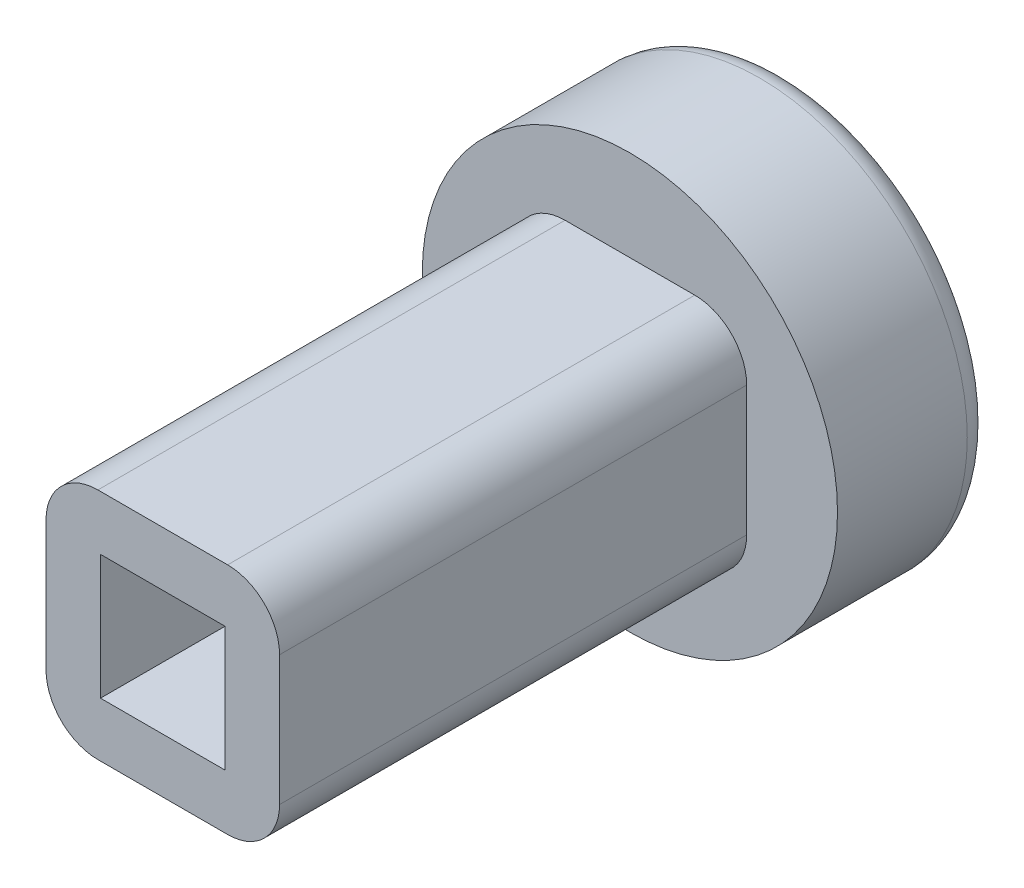
ISO-10303-21;
HEADER;
FILE_DESCRIPTION(('STEP AP214'),'2;1');
FILE_NAME('part.step','',(''),(''),'','','');
FILE_SCHEMA(('AUTOMOTIVE_DESIGN { 1 0 10303 214 1 1 1 1 }'));
ENDSEC;
DATA;
#1=APPLICATION_CONTEXT('core data for automotive mechanical design processes');
#2=APPLICATION_PROTOCOL_DEFINITION('international standard','automotive_design',2000,#1);
#3=PRODUCT_CONTEXT('',#1,'mechanical');
#4=PRODUCT('Part','Part','',(#3));
#5=PRODUCT_RELATED_PRODUCT_CATEGORY('part','',(#4));
#6=PRODUCT_DEFINITION_FORMATION('','',#4);
#7=PRODUCT_DEFINITION_CONTEXT('part definition',#1,'design');
#8=PRODUCT_DEFINITION('design','',#6,#7);
#9=PRODUCT_DEFINITION_SHAPE('','',#8);
#10=(LENGTH_UNIT() NAMED_UNIT(*) SI_UNIT(.MILLI.,.METRE.));
#11=(NAMED_UNIT(*) PLANE_ANGLE_UNIT() SI_UNIT($,.RADIAN.));
#12=(NAMED_UNIT(*) SI_UNIT($,.STERADIAN.) SOLID_ANGLE_UNIT());
#13=UNCERTAINTY_MEASURE_WITH_UNIT(LENGTH_MEASURE(1.E-05),#10,'distance_accuracy_value','');
#14=(GEOMETRIC_REPRESENTATION_CONTEXT(3) GLOBAL_UNCERTAINTY_ASSIGNED_CONTEXT((#13)) GLOBAL_UNIT_ASSIGNED_CONTEXT((#10,
#11,#12)) REPRESENTATION_CONTEXT('',''));
#15=CARTESIAN_POINT('',(0.,0.,0.));
#16=DIRECTION('',(0.,0.,1.));
#17=DIRECTION('',(1.,0.,0.));
#18=AXIS2_PLACEMENT_3D('',#15,#16,#17);
#19=CARTESIAN_POINT('',(0.,0.,3.));
#20=DIRECTION('',(0.,0.,-1.));
#21=DIRECTION('',(-1.,0.,0.));
#22=AXIS2_PLACEMENT_3D('',#19,#20,#21);
#23=CYLINDRICAL_SURFACE('',#22,4.);
#24=CARTESIAN_POINT('',(0.,0.,0.5));
#25=DIRECTION('',(0.,0.,1.));
#26=DIRECTION('',(1.,0.,0.));
#27=AXIS2_PLACEMENT_3D('',#24,#25,#26);
#28=CIRCLE('',#27,4.);
#29=CARTESIAN_POINT('',(4.,0.,0.5));
#30=VERTEX_POINT('',#29);
#31=EDGE_CURVE('E41',#30,#30,#28,.T.);
#32=ORIENTED_EDGE('',*,*,#31,.T.);
#33=EDGE_LOOP('',(#32));
#34=FACE_BOUND('',#33,.T.);
#35=CARTESIAN_POINT('',(0.,0.,3.));
#36=DIRECTION('',(0.,0.,1.));
#37=DIRECTION('',(1.,0.,0.));
#38=AXIS2_PLACEMENT_3D('',#35,#36,#37);
#39=CIRCLE('',#38,4.);
#40=CARTESIAN_POINT('',(4.,0.,3.));
#41=VERTEX_POINT('',#40);
#42=EDGE_CURVE('E180',#41,#41,#39,.T.);
#43=ORIENTED_EDGE('',*,*,#42,.F.);
#44=EDGE_LOOP('',(#43));
#45=FACE_BOUND('',#44,.T.);
#46=ADVANCED_FACE('F33',(#34,#45),#23,.T.);
#47=CARTESIAN_POINT('',(0.,0.,3.));
#48=DIRECTION('',(0.,0.,1.));
#49=DIRECTION('',(1.,0.,0.));
#50=AXIS2_PLACEMENT_3D('',#47,#48,#49);
#51=PLANE('',#50);
#52=DIRECTION('',(0.,-1.,0.));
#53=VECTOR('',#52,1.);
#54=CARTESIAN_POINT('',(-2.25,2.25,3.));
#55=LINE('',#54,#53);
#56=CARTESIAN_POINT('',(-2.25,1.25,3.));
#57=VERTEX_POINT('',#56);
#58=CARTESIAN_POINT('',(-2.25,-1.25,3.));
#59=VERTEX_POINT('',#58);
#60=EDGE_CURVE('E163',#57,#59,#55,.T.);
#61=ORIENTED_EDGE('',*,*,#60,.F.);
#62=CARTESIAN_POINT('',(-1.25,1.25,3.));
#63=DIRECTION('',(0.,0.,1.));
#64=DIRECTION('',(1.,0.,0.));
#65=AXIS2_PLACEMENT_3D('',#62,#63,#64);
#66=CIRCLE('',#65,1.);
#67=CARTESIAN_POINT('',(-1.25,2.25,3.));
#68=VERTEX_POINT('',#67);
#69=EDGE_CURVE('E219',#57,#68,#66,.F.);
#70=ORIENTED_EDGE('',*,*,#69,.T.);
#71=DIRECTION('',(-1.,0.,0.));
#72=VECTOR('',#71,1.);
#73=CARTESIAN_POINT('',(2.25,2.25,3.));
#74=LINE('',#73,#72);
#75=CARTESIAN_POINT('',(1.25,2.25,3.));
#76=VERTEX_POINT('',#75);
#77=EDGE_CURVE('E171',#76,#68,#74,.T.);
#78=ORIENTED_EDGE('',*,*,#77,.F.);
#79=CARTESIAN_POINT('',(1.25,1.25,3.));
#80=DIRECTION('',(0.,0.,1.));
#81=DIRECTION('',(1.,0.,0.));
#82=AXIS2_PLACEMENT_3D('',#79,#80,#81);
#83=CIRCLE('',#82,1.);
#84=CARTESIAN_POINT('',(2.25,1.25,3.));
#85=VERTEX_POINT('',#84);
#86=EDGE_CURVE('E221',#76,#85,#83,.F.);
#87=ORIENTED_EDGE('',*,*,#86,.T.);
#88=DIRECTION('',(0.,1.,0.));
#89=VECTOR('',#88,1.);
#90=CARTESIAN_POINT('',(2.25,2.25,3.));
#91=LINE('',#90,#89);
#92=CARTESIAN_POINT('',(2.25,-1.25,3.));
#93=VERTEX_POINT('',#92);
#94=EDGE_CURVE('E185',#93,#85,#91,.T.);
#95=ORIENTED_EDGE('',*,*,#94,.F.);
#96=CARTESIAN_POINT('',(1.25,-1.25,3.));
#97=DIRECTION('',(0.,0.,1.));
#98=DIRECTION('',(1.,0.,0.));
#99=AXIS2_PLACEMENT_3D('',#96,#97,#98);
#100=CIRCLE('',#99,1.);
#101=CARTESIAN_POINT('',(1.25,-2.25,3.));
#102=VERTEX_POINT('',#101);
#103=EDGE_CURVE('E48',#93,#102,#100,.F.);
#104=ORIENTED_EDGE('',*,*,#103,.T.);
#105=DIRECTION('',(1.,0.,0.));
#106=VECTOR('',#105,1.);
#107=CARTESIAN_POINT('',(2.25,-2.25,3.));
#108=LINE('',#107,#106);
#109=CARTESIAN_POINT('',(-1.25,-2.25,3.));
#110=VERTEX_POINT('',#109);
#111=EDGE_CURVE('E183',#110,#102,#108,.T.);
#112=ORIENTED_EDGE('',*,*,#111,.F.);
#113=CARTESIAN_POINT('',(-1.25,-1.25,3.));
#114=DIRECTION('',(0.,0.,1.));
#115=DIRECTION('',(1.,0.,0.));
#116=AXIS2_PLACEMENT_3D('',#113,#114,#115);
#117=CIRCLE('',#116,1.);
#118=EDGE_CURVE('E56',#110,#59,#117,.F.);
#119=ORIENTED_EDGE('',*,*,#118,.T.);
#120=EDGE_LOOP('',(#61,#70,#78,#87,#95,#104,#112,#119));
#121=FACE_BOUND('',#120,.T.);
#122=ORIENTED_EDGE('',*,*,#42,.T.);
#123=EDGE_LOOP('',(#122));
#124=FACE_BOUND('',#123,.T.);
#125=ADVANCED_FACE('F238',(#121,#124),#51,.T.);
#126=CARTESIAN_POINT('',(0.,0.,0.));
#127=DIRECTION('',(0.,0.,1.));
#128=DIRECTION('',(1.,0.,0.));
#129=AXIS2_PLACEMENT_3D('',#126,#127,#128);
#130=PLANE('',#129);
#131=CARTESIAN_POINT('',(0.,0.,0.));
#132=DIRECTION('',(0.,0.,1.));
#133=DIRECTION('',(1.,0.,0.));
#134=AXIS2_PLACEMENT_3D('',#131,#132,#133);
#135=CIRCLE('',#134,3.5);
#136=CARTESIAN_POINT('',(3.5,0.,0.));
#137=VERTEX_POINT('',#136);
#138=EDGE_CURVE('E11',#137,#137,#135,.F.);
#139=ORIENTED_EDGE('',*,*,#138,.T.);
#140=EDGE_LOOP('',(#139));
#141=FACE_BOUND('',#140,.T.);
#142=ADVANCED_FACE('F243',(#141),#130,.F.);
#143=CARTESIAN_POINT('',(-2.25,2.25,12.));
#144=DIRECTION('',(1.,0.,0.));
#145=DIRECTION('',(0.,1.,0.));
#146=AXIS2_PLACEMENT_3D('',#143,#144,#145);
#147=PLANE('',#146);
#148=DIRECTION('',(0.,-1.,0.));
#149=VECTOR('',#148,1.);
#150=CARTESIAN_POINT('',(-2.25,2.25,12.));
#151=LINE('',#150,#149);
#152=CARTESIAN_POINT('',(-2.25,1.25,12.));
#153=VERTEX_POINT('',#152);
#154=CARTESIAN_POINT('',(-2.25,-1.25,12.));
#155=VERTEX_POINT('',#154);
#156=EDGE_CURVE('E167',#153,#155,#151,.T.);
#157=ORIENTED_EDGE('',*,*,#156,.F.);
#158=DIRECTION('',(0.,0.,-1.));
#159=VECTOR('',#158,1.);
#160=CARTESIAN_POINT('',(-2.25,1.25,12.));
#161=LINE('',#160,#159);
#162=EDGE_CURVE('E194',#153,#57,#161,.T.);
#163=ORIENTED_EDGE('',*,*,#162,.T.);
#164=ORIENTED_EDGE('',*,*,#60,.T.);
#165=DIRECTION('',(0.,0.,-1.));
#166=VECTOR('',#165,1.);
#167=CARTESIAN_POINT('',(-2.25,-1.25,12.));
#168=LINE('',#167,#166);
#169=EDGE_CURVE('E192',#59,#155,#168,.F.);
#170=ORIENTED_EDGE('',*,*,#169,.T.);
#171=EDGE_LOOP('',(#157,#163,#164,#170));
#172=FACE_BOUND('',#171,.T.);
#173=ADVANCED_FACE('F281',(#172),#147,.F.);
#174=CARTESIAN_POINT('',(2.25,-2.25,12.));
#175=DIRECTION('',(0.,1.,0.));
#176=DIRECTION('',(-1.,0.,0.));
#177=AXIS2_PLACEMENT_3D('',#174,#175,#176);
#178=PLANE('',#177);
#179=ORIENTED_EDGE('',*,*,#111,.T.);
#180=DIRECTION('',(0.,0.,-1.));
#181=VECTOR('',#180,1.);
#182=CARTESIAN_POINT('',(1.25,-2.25,12.));
#183=LINE('',#182,#181);
#184=CARTESIAN_POINT('',(1.25,-2.25,12.));
#185=VERTEX_POINT('',#184);
#186=EDGE_CURVE('E217',#102,#185,#183,.F.);
#187=ORIENTED_EDGE('',*,*,#186,.T.);
#188=DIRECTION('',(1.,0.,0.));
#189=VECTOR('',#188,1.);
#190=CARTESIAN_POINT('',(2.25,-2.25,12.));
#191=LINE('',#190,#189);
#192=CARTESIAN_POINT('',(-1.25,-2.25,12.));
#193=VERTEX_POINT('',#192);
#194=EDGE_CURVE('E170',#193,#185,#191,.T.);
#195=ORIENTED_EDGE('',*,*,#194,.F.);
#196=DIRECTION('',(0.,0.,-1.));
#197=VECTOR('',#196,1.);
#198=CARTESIAN_POINT('',(-1.25,-2.25,12.));
#199=LINE('',#198,#197);
#200=EDGE_CURVE('E215',#193,#110,#199,.T.);
#201=ORIENTED_EDGE('',*,*,#200,.T.);
#202=EDGE_LOOP('',(#179,#187,#195,#201));
#203=FACE_BOUND('',#202,.T.);
#204=ADVANCED_FACE('F284',(#203),#178,.F.);
#205=CARTESIAN_POINT('',(2.25,2.25,12.));
#206=DIRECTION('',(-1.,0.,0.));
#207=DIRECTION('',(0.,-1.,0.));
#208=AXIS2_PLACEMENT_3D('',#205,#206,#207);
#209=PLANE('',#208);
#210=ORIENTED_EDGE('',*,*,#94,.T.);
#211=DIRECTION('',(0.,0.,-1.));
#212=VECTOR('',#211,1.);
#213=CARTESIAN_POINT('',(2.25,1.25,12.));
#214=LINE('',#213,#212);
#215=CARTESIAN_POINT('',(2.25,1.25,12.));
#216=VERTEX_POINT('',#215);
#217=EDGE_CURVE('E213',#85,#216,#214,.F.);
#218=ORIENTED_EDGE('',*,*,#217,.T.);
#219=DIRECTION('',(0.,1.,0.));
#220=VECTOR('',#219,1.);
#221=CARTESIAN_POINT('',(2.25,2.25,12.));
#222=LINE('',#221,#220);
#223=CARTESIAN_POINT('',(2.25,-1.25,12.));
#224=VERTEX_POINT('',#223);
#225=EDGE_CURVE('E174',#224,#216,#222,.T.);
#226=ORIENTED_EDGE('',*,*,#225,.F.);
#227=DIRECTION('',(0.,0.,-1.));
#228=VECTOR('',#227,1.);
#229=CARTESIAN_POINT('',(2.25,-1.25,12.));
#230=LINE('',#229,#228);
#231=EDGE_CURVE('E210',#224,#93,#230,.T.);
#232=ORIENTED_EDGE('',*,*,#231,.T.);
#233=EDGE_LOOP('',(#210,#218,#226,#232));
#234=FACE_BOUND('',#233,.T.);
#235=ADVANCED_FACE('F268',(#234),#209,.F.);
#236=CARTESIAN_POINT('',(2.25,2.25,12.));
#237=DIRECTION('',(0.,-1.,0.));
#238=DIRECTION('',(1.,0.,0.));
#239=AXIS2_PLACEMENT_3D('',#236,#237,#238);
#240=PLANE('',#239);
#241=ORIENTED_EDGE('',*,*,#77,.T.);
#242=DIRECTION('',(0.,0.,-1.));
#243=VECTOR('',#242,1.);
#244=CARTESIAN_POINT('',(-1.25,2.25,12.));
#245=LINE('',#244,#243);
#246=CARTESIAN_POINT('',(-1.25,2.25,12.));
#247=VERTEX_POINT('',#246);
#248=EDGE_CURVE('E200',#68,#247,#245,.F.);
#249=ORIENTED_EDGE('',*,*,#248,.T.);
#250=DIRECTION('',(-1.,0.,0.));
#251=VECTOR('',#250,1.);
#252=CARTESIAN_POINT('',(2.25,2.25,12.));
#253=LINE('',#252,#251);
#254=CARTESIAN_POINT('',(1.25,2.25,12.));
#255=VERTEX_POINT('',#254);
#256=EDGE_CURVE('E177',#255,#247,#253,.T.);
#257=ORIENTED_EDGE('',*,*,#256,.F.);
#258=DIRECTION('',(0.,0.,-1.));
#259=VECTOR('',#258,1.);
#260=CARTESIAN_POINT('',(1.25,2.25,12.));
#261=LINE('',#260,#259);
#262=EDGE_CURVE('E197',#255,#76,#261,.T.);
#263=ORIENTED_EDGE('',*,*,#262,.T.);
#264=EDGE_LOOP('',(#241,#249,#257,#263));
#265=FACE_BOUND('',#264,.T.);
#266=ADVANCED_FACE('F274',(#265),#240,.F.);
#267=CARTESIAN_POINT('',(0.,0.,12.));
#268=DIRECTION('',(0.,0.,-1.));
#269=DIRECTION('',(-1.,0.,0.));
#270=AXIS2_PLACEMENT_3D('',#267,#268,#269);
#271=PLANE('',#270);
#272=DIRECTION('',(1.,0.,0.));
#273=VECTOR('',#272,1.);
#274=CARTESIAN_POINT('',(1.2,-1.2,12.));
#275=LINE('',#274,#273);
#276=CARTESIAN_POINT('',(-1.2,-1.2,12.));
#277=VERTEX_POINT('',#276);
#278=CARTESIAN_POINT('',(1.2,-1.2,12.));
#279=VERTEX_POINT('',#278);
#280=EDGE_CURVE('E157',#277,#279,#275,.T.);
#281=ORIENTED_EDGE('',*,*,#280,.F.);
#282=DIRECTION('',(0.,-1.,0.));
#283=VECTOR('',#282,1.);
#284=CARTESIAN_POINT('',(-1.2,1.2,12.));
#285=LINE('',#284,#283);
#286=CARTESIAN_POINT('',(-1.2,1.2,12.));
#287=VERTEX_POINT('',#286);
#288=EDGE_CURVE('E131',#287,#277,#285,.T.);
#289=ORIENTED_EDGE('',*,*,#288,.F.);
#290=DIRECTION('',(-1.,0.,0.));
#291=VECTOR('',#290,1.);
#292=CARTESIAN_POINT('',(1.2,1.2,12.));
#293=LINE('',#292,#291);
#294=CARTESIAN_POINT('',(1.2,1.2,12.));
#295=VERTEX_POINT('',#294);
#296=EDGE_CURVE('E148',#295,#287,#293,.T.);
#297=ORIENTED_EDGE('',*,*,#296,.F.);
#298=DIRECTION('',(0.,1.,0.));
#299=VECTOR('',#298,1.);
#300=CARTESIAN_POINT('',(1.2,1.2,12.));
#301=LINE('',#300,#299);
#302=EDGE_CURVE('E151',#279,#295,#301,.T.);
#303=ORIENTED_EDGE('',*,*,#302,.F.);
#304=EDGE_LOOP('',(#281,#289,#297,#303));
#305=FACE_BOUND('',#304,.T.);
#306=ORIENTED_EDGE('',*,*,#256,.T.);
#307=CARTESIAN_POINT('',(-1.25,1.25,12.));
#308=DIRECTION('',(0.,0.,-1.));
#309=DIRECTION('',(-1.,0.,0.));
#310=AXIS2_PLACEMENT_3D('',#307,#308,#309);
#311=CIRCLE('',#310,1.);
#312=EDGE_CURVE('E208',#247,#153,#311,.F.);
#313=ORIENTED_EDGE('',*,*,#312,.T.);
#314=ORIENTED_EDGE('',*,*,#156,.T.);
#315=CARTESIAN_POINT('',(-1.25,-1.25,12.));
#316=DIRECTION('',(0.,0.,-1.));
#317=DIRECTION('',(-1.,0.,0.));
#318=AXIS2_PLACEMENT_3D('',#315,#316,#317);
#319=CIRCLE('',#318,1.);
#320=EDGE_CURVE('E202',#155,#193,#319,.F.);
#321=ORIENTED_EDGE('',*,*,#320,.T.);
#322=ORIENTED_EDGE('',*,*,#194,.T.);
#323=CARTESIAN_POINT('',(1.25,-1.25,12.));
#324=DIRECTION('',(0.,0.,-1.));
#325=DIRECTION('',(-1.,0.,0.));
#326=AXIS2_PLACEMENT_3D('',#323,#324,#325);
#327=CIRCLE('',#326,1.);
#328=EDGE_CURVE('E204',#185,#224,#327,.F.);
#329=ORIENTED_EDGE('',*,*,#328,.T.);
#330=ORIENTED_EDGE('',*,*,#225,.T.);
#331=CARTESIAN_POINT('',(1.25,1.25,12.));
#332=DIRECTION('',(0.,0.,-1.));
#333=DIRECTION('',(-1.,0.,0.));
#334=AXIS2_PLACEMENT_3D('',#331,#332,#333);
#335=CIRCLE('',#334,1.);
#336=EDGE_CURVE('E206',#216,#255,#335,.F.);
#337=ORIENTED_EDGE('',*,*,#336,.T.);
#338=EDGE_LOOP('',(#306,#313,#314,#321,#322,#329,#330,#337));
#339=FACE_BOUND('',#338,.T.);
#340=ADVANCED_FACE('F264',(#305,#339),#271,.F.);
#341=CARTESIAN_POINT('',(-1.2,1.2,9.));
#342=DIRECTION('',(-1.,0.,0.));
#343=DIRECTION('',(0.,-1.,0.));
#344=AXIS2_PLACEMENT_3D('',#341,#342,#343);
#345=PLANE('',#344);
#346=ORIENTED_EDGE('',*,*,#288,.T.);
#347=DIRECTION('',(0.,0.,1.));
#348=VECTOR('',#347,1.);
#349=CARTESIAN_POINT('',(-1.2,-1.2,9.));
#350=LINE('',#349,#348);
#351=CARTESIAN_POINT('',(-1.2,-1.2,9.));
#352=VERTEX_POINT('',#351);
#353=EDGE_CURVE('E124',#352,#277,#350,.T.);
#354=ORIENTED_EDGE('',*,*,#353,.F.);
#355=DIRECTION('',(0.,-1.,0.));
#356=VECTOR('',#355,1.);
#357=CARTESIAN_POINT('',(-1.2,1.2,9.));
#358=LINE('',#357,#356);
#359=CARTESIAN_POINT('',(-1.2,1.2,9.));
#360=VERTEX_POINT('',#359);
#361=EDGE_CURVE('E128',#360,#352,#358,.T.);
#362=ORIENTED_EDGE('',*,*,#361,.F.);
#363=DIRECTION('',(0.,0.,1.));
#364=VECTOR('',#363,1.);
#365=CARTESIAN_POINT('',(-1.2,1.2,9.));
#366=LINE('',#365,#364);
#367=EDGE_CURVE('E161',#360,#287,#366,.T.);
#368=ORIENTED_EDGE('',*,*,#367,.T.);
#369=EDGE_LOOP('',(#346,#354,#362,#368));
#370=FACE_BOUND('',#369,.T.);
#371=ADVANCED_FACE('F126',(#370),#345,.F.);
#372=CARTESIAN_POINT('',(1.2,1.2,9.));
#373=DIRECTION('',(0.,1.,0.));
#374=DIRECTION('',(-1.,0.,0.));
#375=AXIS2_PLACEMENT_3D('',#372,#373,#374);
#376=PLANE('',#375);
#377=ORIENTED_EDGE('',*,*,#296,.T.);
#378=ORIENTED_EDGE('',*,*,#367,.F.);
#379=DIRECTION('',(-1.,0.,0.));
#380=VECTOR('',#379,1.);
#381=CARTESIAN_POINT('',(1.2,1.2,9.));
#382=LINE('',#381,#380);
#383=CARTESIAN_POINT('',(1.2,1.2,9.));
#384=VERTEX_POINT('',#383);
#385=EDGE_CURVE('E136',#384,#360,#382,.T.);
#386=ORIENTED_EDGE('',*,*,#385,.F.);
#387=DIRECTION('',(0.,0.,1.));
#388=VECTOR('',#387,1.);
#389=CARTESIAN_POINT('',(1.2,1.2,9.));
#390=LINE('',#389,#388);
#391=EDGE_CURVE('E164',#384,#295,#390,.T.);
#392=ORIENTED_EDGE('',*,*,#391,.T.);
#393=EDGE_LOOP('',(#377,#378,#386,#392));
#394=FACE_BOUND('',#393,.T.);
#395=ADVANCED_FACE('F303',(#394),#376,.F.);
#396=CARTESIAN_POINT('',(1.2,1.2,9.));
#397=DIRECTION('',(1.,0.,0.));
#398=DIRECTION('',(0.,1.,0.));
#399=AXIS2_PLACEMENT_3D('',#396,#397,#398);
#400=PLANE('',#399);
#401=ORIENTED_EDGE('',*,*,#302,.T.);
#402=ORIENTED_EDGE('',*,*,#391,.F.);
#403=DIRECTION('',(0.,1.,0.));
#404=VECTOR('',#403,1.);
#405=CARTESIAN_POINT('',(1.2,1.2,9.));
#406=LINE('',#405,#404);
#407=CARTESIAN_POINT('',(1.2,-1.2,9.));
#408=VERTEX_POINT('',#407);
#409=EDGE_CURVE('E144',#408,#384,#406,.T.);
#410=ORIENTED_EDGE('',*,*,#409,.F.);
#411=DIRECTION('',(0.,0.,1.));
#412=VECTOR('',#411,1.);
#413=CARTESIAN_POINT('',(1.2,-1.2,9.));
#414=LINE('',#413,#412);
#415=EDGE_CURVE('E135',#408,#279,#414,.T.);
#416=ORIENTED_EDGE('',*,*,#415,.T.);
#417=EDGE_LOOP('',(#401,#402,#410,#416));
#418=FACE_BOUND('',#417,.T.);
#419=ADVANCED_FACE('F306',(#418),#400,.F.);
#420=CARTESIAN_POINT('',(1.2,-1.2,9.));
#421=DIRECTION('',(0.,-1.,0.));
#422=DIRECTION('',(1.,0.,0.));
#423=AXIS2_PLACEMENT_3D('',#420,#421,#422);
#424=PLANE('',#423);
#425=ORIENTED_EDGE('',*,*,#280,.T.);
#426=ORIENTED_EDGE('',*,*,#415,.F.);
#427=DIRECTION('',(1.,0.,0.));
#428=VECTOR('',#427,1.);
#429=CARTESIAN_POINT('',(1.2,-1.2,9.));
#430=LINE('',#429,#428);
#431=EDGE_CURVE('E139',#352,#408,#430,.T.);
#432=ORIENTED_EDGE('',*,*,#431,.F.);
#433=ORIENTED_EDGE('',*,*,#353,.T.);
#434=EDGE_LOOP('',(#425,#426,#432,#433));
#435=FACE_BOUND('',#434,.T.);
#436=ADVANCED_FACE('F140',(#435),#424,.F.);
#437=CARTESIAN_POINT('',(0.,0.,9.));
#438=DIRECTION('',(0.,0.,-1.));
#439=DIRECTION('',(-1.,0.,0.));
#440=AXIS2_PLACEMENT_3D('',#437,#438,#439);
#441=PLANE('',#440);
#442=ORIENTED_EDGE('',*,*,#361,.T.);
#443=ORIENTED_EDGE('',*,*,#431,.T.);
#444=ORIENTED_EDGE('',*,*,#409,.T.);
#445=ORIENTED_EDGE('',*,*,#385,.T.);
#446=EDGE_LOOP('',(#442,#443,#444,#445));
#447=FACE_BOUND('',#446,.T.);
#448=ADVANCED_FACE('F146',(#447),#441,.F.);
#449=CARTESIAN_POINT('',(-1.25,1.25,12.));
#450=DIRECTION('',(0.,0.,-1.));
#451=DIRECTION('',(-1.,0.,0.));
#452=AXIS2_PLACEMENT_3D('',#449,#450,#451);
#453=CYLINDRICAL_SURFACE('',#452,1.);
#454=ORIENTED_EDGE('',*,*,#312,.F.);
#455=ORIENTED_EDGE('',*,*,#248,.F.);
#456=ORIENTED_EDGE('',*,*,#69,.F.);
#457=ORIENTED_EDGE('',*,*,#162,.F.);
#458=EDGE_LOOP('',(#454,#455,#456,#457));
#459=FACE_BOUND('',#458,.T.);
#460=ADVANCED_FACE('F247',(#459),#453,.T.);
#461=CARTESIAN_POINT('',(1.25,1.25,12.));
#462=DIRECTION('',(0.,0.,-1.));
#463=DIRECTION('',(-1.,0.,0.));
#464=AXIS2_PLACEMENT_3D('',#461,#462,#463);
#465=CYLINDRICAL_SURFACE('',#464,1.);
#466=ORIENTED_EDGE('',*,*,#336,.F.);
#467=ORIENTED_EDGE('',*,*,#217,.F.);
#468=ORIENTED_EDGE('',*,*,#86,.F.);
#469=ORIENTED_EDGE('',*,*,#262,.F.);
#470=EDGE_LOOP('',(#466,#467,#468,#469));
#471=FACE_BOUND('',#470,.T.);
#472=ADVANCED_FACE('F250',(#471),#465,.T.);
#473=CARTESIAN_POINT('',(1.25,-1.25,12.));
#474=DIRECTION('',(0.,0.,-1.));
#475=DIRECTION('',(-1.,0.,0.));
#476=AXIS2_PLACEMENT_3D('',#473,#474,#475);
#477=CYLINDRICAL_SURFACE('',#476,1.);
#478=ORIENTED_EDGE('',*,*,#328,.F.);
#479=ORIENTED_EDGE('',*,*,#186,.F.);
#480=ORIENTED_EDGE('',*,*,#103,.F.);
#481=ORIENTED_EDGE('',*,*,#231,.F.);
#482=EDGE_LOOP('',(#478,#479,#480,#481));
#483=FACE_BOUND('',#482,.T.);
#484=ADVANCED_FACE('F235',(#483),#477,.T.);
#485=CARTESIAN_POINT('',(-1.25,-1.25,12.));
#486=DIRECTION('',(0.,0.,-1.));
#487=DIRECTION('',(-1.,0.,0.));
#488=AXIS2_PLACEMENT_3D('',#485,#486,#487);
#489=CYLINDRICAL_SURFACE('',#488,1.);
#490=ORIENTED_EDGE('',*,*,#320,.F.);
#491=ORIENTED_EDGE('',*,*,#169,.F.);
#492=ORIENTED_EDGE('',*,*,#118,.F.);
#493=ORIENTED_EDGE('',*,*,#200,.F.);
#494=EDGE_LOOP('',(#490,#491,#492,#493));
#495=FACE_BOUND('',#494,.T.);
#496=ADVANCED_FACE('F230',(#495),#489,.T.);
#497=CARTESIAN_POINT('',(0.,0.,0.5));
#498=DIRECTION('',(0.,0.,1.));
#499=DIRECTION('',(1.,0.,0.));
#500=AXIS2_PLACEMENT_3D('',#497,#498,#499);
#501=TOROIDAL_SURFACE('',#500,3.5,0.5);
#502=ORIENTED_EDGE('',*,*,#138,.F.);
#503=EDGE_LOOP('',(#502));
#504=FACE_BOUND('',#503,.T.);
#505=ORIENTED_EDGE('',*,*,#31,.F.);
#506=EDGE_LOOP('',(#505));
#507=FACE_BOUND('',#506,.T.);
#508=ADVANCED_FACE('F35',(#504,#507),#501,.T.);
#509=CLOSED_SHELL('',(#46,#125,#142,#173,#204,#235,#266,#340,#371,#395,#419,#436,#448,#460,#472,
#484,#496,#508));
#510=MANIFOLD_SOLID_BREP('B2',#509);
#511=ADVANCED_BREP_SHAPE_REPRESENTATION('',(#18,#510),#14);
#512=SHAPE_DEFINITION_REPRESENTATION(#9,#511);
ENDSEC;
END-ISO-10303-21;
